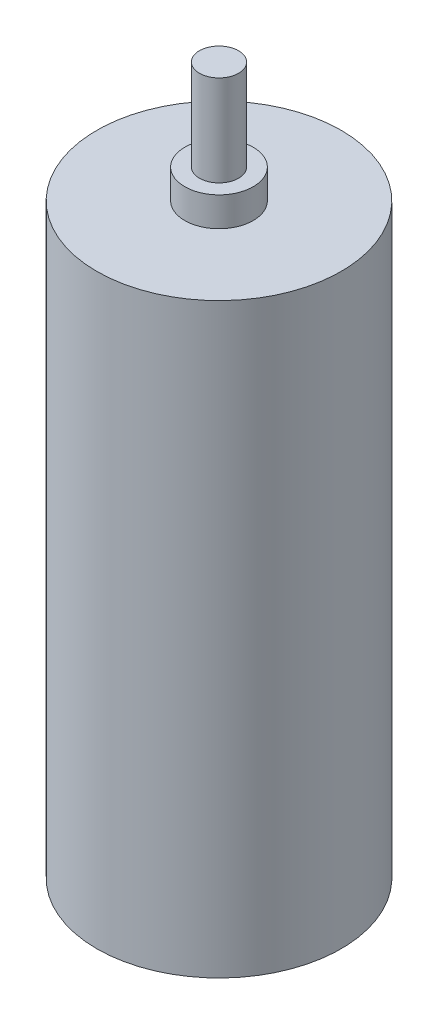
ISO-10303-21;
HEADER;
FILE_DESCRIPTION(('STEP AP214'),'2;1');
FILE_NAME('part.step','',(''),(''),'','','');
FILE_SCHEMA(('AUTOMOTIVE_DESIGN { 1 0 10303 214 1 1 1 1 }'));
ENDSEC;
DATA;
#1=APPLICATION_CONTEXT('core data for automotive mechanical design processes');
#2=APPLICATION_PROTOCOL_DEFINITION('international standard','automotive_design',2000,#1);
#3=PRODUCT_CONTEXT('',#1,'mechanical');
#4=PRODUCT('Part','Part','',(#3));
#5=PRODUCT_RELATED_PRODUCT_CATEGORY('part','',(#4));
#6=PRODUCT_DEFINITION_FORMATION('','',#4);
#7=PRODUCT_DEFINITION_CONTEXT('part definition',#1,'design');
#8=PRODUCT_DEFINITION('design','',#6,#7);
#9=PRODUCT_DEFINITION_SHAPE('','',#8);
#10=(LENGTH_UNIT() NAMED_UNIT(*) SI_UNIT(.MILLI.,.METRE.));
#11=(NAMED_UNIT(*) PLANE_ANGLE_UNIT() SI_UNIT($,.RADIAN.));
#12=(NAMED_UNIT(*) SI_UNIT($,.STERADIAN.) SOLID_ANGLE_UNIT());
#13=UNCERTAINTY_MEASURE_WITH_UNIT(LENGTH_MEASURE(1.E-05),#10,'distance_accuracy_value','');
#14=(GEOMETRIC_REPRESENTATION_CONTEXT(3) GLOBAL_UNCERTAINTY_ASSIGNED_CONTEXT((#13)) GLOBAL_UNIT_ASSIGNED_CONTEXT((#10,
#11,#12)) REPRESENTATION_CONTEXT('',''));
#15=CARTESIAN_POINT('',(0.,0.,0.));
#16=DIRECTION('',(0.,0.,1.));
#17=DIRECTION('',(1.,0.,0.));
#18=AXIS2_PLACEMENT_3D('',#15,#16,#17);
#19=CARTESIAN_POINT('',(0.,3.,0.));
#20=DIRECTION('',(0.,1.,0.));
#21=DIRECTION('',(0.,0.,1.));
#22=AXIS2_PLACEMENT_3D('',#19,#20,#21);
#23=PLANE('',#22);
#24=CARTESIAN_POINT('',(0.,3.,0.));
#25=DIRECTION('',(0.,1.,0.));
#26=DIRECTION('',(0.,0.,1.));
#27=AXIS2_PLACEMENT_3D('',#24,#25,#26);
#28=CIRCLE('',#27,3.5);
#29=CARTESIAN_POINT('',(0.,3.,3.5));
#30=VERTEX_POINT('',#29);
#31=EDGE_CURVE('E42',#30,#30,#28,.T.);
#32=ORIENTED_EDGE('',*,*,#31,.T.);
#33=EDGE_LOOP('',(#32));
#34=FACE_BOUND('',#33,.T.);
#35=CARTESIAN_POINT('',(0.,3.,0.));
#36=DIRECTION('',(0.,1.,0.));
#37=DIRECTION('',(0.,0.,1.));
#38=AXIS2_PLACEMENT_3D('',#35,#36,#37);
#39=CIRCLE('',#38,2.);
#40=CARTESIAN_POINT('',(0.,3.,2.));
#41=VERTEX_POINT('',#40);
#42=EDGE_CURVE('E50',#41,#41,#39,.T.);
#43=ORIENTED_EDGE('',*,*,#42,.F.);
#44=EDGE_LOOP('',(#43));
#45=FACE_BOUND('',#44,.T.);
#46=ADVANCED_FACE('F31',(#34,#45),#23,.T.);
#47=CARTESIAN_POINT('',(0.,0.,0.));
#48=DIRECTION('',(0.,1.,0.));
#49=DIRECTION('',(0.,0.,1.));
#50=AXIS2_PLACEMENT_3D('',#47,#48,#49);
#51=PLANE('',#50);
#52=CARTESIAN_POINT('',(0.,0.,0.));
#53=DIRECTION('',(0.,1.,0.));
#54=DIRECTION('',(0.,0.,1.));
#55=AXIS2_PLACEMENT_3D('',#52,#53,#54);
#56=CIRCLE('',#55,12.5);
#57=CARTESIAN_POINT('',(0.,0.,12.5));
#58=VERTEX_POINT('',#57);
#59=EDGE_CURVE('E35',#58,#58,#56,.T.);
#60=ORIENTED_EDGE('',*,*,#59,.T.);
#61=EDGE_LOOP('',(#60));
#62=FACE_BOUND('',#61,.T.);
#63=CARTESIAN_POINT('',(0.,0.,0.));
#64=DIRECTION('',(0.,1.,0.));
#65=DIRECTION('',(0.,0.,1.));
#66=AXIS2_PLACEMENT_3D('',#63,#64,#65);
#67=CIRCLE('',#66,3.5);
#68=CARTESIAN_POINT('',(0.,0.,3.5));
#69=VERTEX_POINT('',#68);
#70=EDGE_CURVE('E44',#69,#69,#67,.T.);
#71=ORIENTED_EDGE('',*,*,#70,.F.);
#72=EDGE_LOOP('',(#71));
#73=FACE_BOUND('',#72,.T.);
#74=ADVANCED_FACE('F66',(#62,#73),#51,.T.);
#75=CARTESIAN_POINT('',(0.,-60.,0.));
#76=DIRECTION('',(0.,1.,0.));
#77=DIRECTION('',(0.,0.,1.));
#78=AXIS2_PLACEMENT_3D('',#75,#76,#77);
#79=CYLINDRICAL_SURFACE('',#78,12.5);
#80=CARTESIAN_POINT('',(0.,-60.,0.));
#81=DIRECTION('',(0.,1.,0.));
#82=DIRECTION('',(0.,0.,1.));
#83=AXIS2_PLACEMENT_3D('',#80,#81,#82);
#84=CIRCLE('',#83,12.5);
#85=CARTESIAN_POINT('',(0.,-60.,12.5));
#86=VERTEX_POINT('',#85);
#87=EDGE_CURVE('E10',#86,#86,#84,.T.);
#88=ORIENTED_EDGE('',*,*,#87,.T.);
#89=EDGE_LOOP('',(#88));
#90=FACE_BOUND('',#89,.T.);
#91=ORIENTED_EDGE('',*,*,#59,.F.);
#92=EDGE_LOOP('',(#91));
#93=FACE_BOUND('',#92,.T.);
#94=ADVANCED_FACE('F33',(#90,#93),#79,.T.);
#95=CARTESIAN_POINT('',(0.,-60.,0.));
#96=DIRECTION('',(0.,1.,0.));
#97=DIRECTION('',(0.,0.,1.));
#98=AXIS2_PLACEMENT_3D('',#95,#96,#97);
#99=PLANE('',#98);
#100=ORIENTED_EDGE('',*,*,#87,.F.);
#101=EDGE_LOOP('',(#100));
#102=FACE_BOUND('',#101,.T.);
#103=ADVANCED_FACE('F77',(#102),#99,.F.);
#104=CARTESIAN_POINT('',(0.,3.,0.));
#105=DIRECTION('',(0.,-1.,0.));
#106=DIRECTION('',(0.,0.,-1.));
#107=AXIS2_PLACEMENT_3D('',#104,#105,#106);
#108=CYLINDRICAL_SURFACE('',#107,3.5);
#109=ORIENTED_EDGE('',*,*,#31,.F.);
#110=EDGE_LOOP('',(#109));
#111=FACE_BOUND('',#110,.T.);
#112=ORIENTED_EDGE('',*,*,#70,.T.);
#113=EDGE_LOOP('',(#112));
#114=FACE_BOUND('',#113,.T.);
#115=ADVANCED_FACE('F61',(#111,#114),#108,.T.);
#116=CARTESIAN_POINT('',(0.,12.3,0.));
#117=DIRECTION('',(0.,-1.,0.));
#118=DIRECTION('',(0.,0.,-1.));
#119=AXIS2_PLACEMENT_3D('',#116,#117,#118);
#120=CYLINDRICAL_SURFACE('',#119,2.);
#121=CARTESIAN_POINT('',(0.,12.3,0.));
#122=DIRECTION('',(0.,1.,0.));
#123=DIRECTION('',(0.,0.,1.));
#124=AXIS2_PLACEMENT_3D('',#121,#122,#123);
#125=CIRCLE('',#124,2.);
#126=CARTESIAN_POINT('',(0.,12.3,2.));
#127=VERTEX_POINT('',#126);
#128=EDGE_CURVE('E47',#127,#127,#125,.T.);
#129=ORIENTED_EDGE('',*,*,#128,.F.);
#130=EDGE_LOOP('',(#129));
#131=FACE_BOUND('',#130,.T.);
#132=ORIENTED_EDGE('',*,*,#42,.T.);
#133=EDGE_LOOP('',(#132));
#134=FACE_BOUND('',#133,.T.);
#135=ADVANCED_FACE('F58',(#131,#134),#120,.T.);
#136=CARTESIAN_POINT('',(0.,12.3,0.));
#137=DIRECTION('',(0.,1.,0.));
#138=DIRECTION('',(0.,0.,1.));
#139=AXIS2_PLACEMENT_3D('',#136,#137,#138);
#140=PLANE('',#139);
#141=ORIENTED_EDGE('',*,*,#128,.T.);
#142=EDGE_LOOP('',(#141));
#143=FACE_BOUND('',#142,.T.);
#144=ADVANCED_FACE('F56',(#143),#140,.T.);
#145=CLOSED_SHELL('',(#46,#74,#94,#103,#115,#135,#144));
#146=MANIFOLD_SOLID_BREP('B2',#145);
#147=ADVANCED_BREP_SHAPE_REPRESENTATION('',(#18,#146),#14);
#148=SHAPE_DEFINITION_REPRESENTATION(#9,#147);
ENDSEC;
END-ISO-10303-21;
